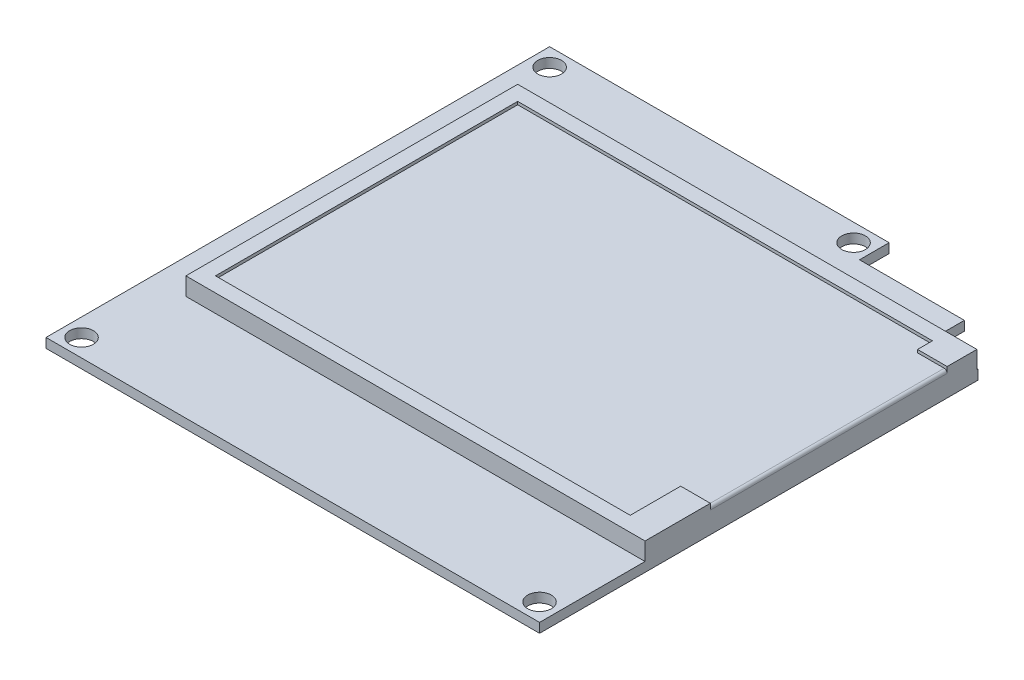
ISO-10303-21;
HEADER;
FILE_DESCRIPTION(('STEP AP214'),'2;1');
FILE_NAME('part.step','',(''),(''),'','','');
FILE_SCHEMA(('AUTOMOTIVE_DESIGN { 1 0 10303 214 1 1 1 1 }'));
ENDSEC;
DATA;
#1=APPLICATION_CONTEXT('core data for automotive mechanical design processes');
#2=APPLICATION_PROTOCOL_DEFINITION('international standard','automotive_design',2000,#1);
#3=PRODUCT_CONTEXT('',#1,'mechanical');
#4=PRODUCT('Part','Part','',(#3));
#5=PRODUCT_RELATED_PRODUCT_CATEGORY('part','',(#4));
#6=PRODUCT_DEFINITION_FORMATION('','',#4);
#7=PRODUCT_DEFINITION_CONTEXT('part definition',#1,'design');
#8=PRODUCT_DEFINITION('design','',#6,#7);
#9=PRODUCT_DEFINITION_SHAPE('','',#8);
#10=(LENGTH_UNIT() NAMED_UNIT(*) SI_UNIT(.MILLI.,.METRE.));
#11=(NAMED_UNIT(*) PLANE_ANGLE_UNIT() SI_UNIT($,.RADIAN.));
#12=(NAMED_UNIT(*) SI_UNIT($,.STERADIAN.) SOLID_ANGLE_UNIT());
#13=UNCERTAINTY_MEASURE_WITH_UNIT(LENGTH_MEASURE(1.E-05),#10,'distance_accuracy_value','');
#14=(GEOMETRIC_REPRESENTATION_CONTEXT(3) GLOBAL_UNCERTAINTY_ASSIGNED_CONTEXT((#13)) GLOBAL_UNIT_ASSIGNED_CONTEXT((#10,
#11,#12)) REPRESENTATION_CONTEXT('',''));
#15=CARTESIAN_POINT('',(0.,0.,0.));
#16=DIRECTION('',(0.,0.,1.));
#17=DIRECTION('',(1.,0.,0.));
#18=AXIS2_PLACEMENT_3D('',#15,#16,#17);
#19=CARTESIAN_POINT('',(78.2993097594836,4.1,-20.3066246880764));
#20=DIRECTION('',(1.,0.,0.));
#21=DIRECTION('',(0.,0.,-1.));
#22=AXIS2_PLACEMENT_3D('',#19,#20,#21);
#23=PLANE('',#22);
#24=DIRECTION('',(0.,0.,-1.));
#25=VECTOR('',#24,1.);
#26=CARTESIAN_POINT('',(78.2993097594836,4.6,-20.3066246880764));
#27=LINE('',#26,#25);
#28=CARTESIAN_POINT('',(78.2993097594836,4.6,-20.3066246880764));
#29=VERTEX_POINT('',#28);
#30=CARTESIAN_POINT('',(78.2993097594836,4.6,-28.823239899312));
#31=VERTEX_POINT('',#30);
#32=EDGE_CURVE('E193',#29,#31,#27,.T.);
#33=ORIENTED_EDGE('',*,*,#32,.T.);
#34=DIRECTION('',(0.,1.,0.));
#35=VECTOR('',#34,1.);
#36=CARTESIAN_POINT('',(78.2993097594836,4.1,-28.823239899312));
#37=LINE('',#36,#35);
#38=CARTESIAN_POINT('',(78.2993097594836,4.1,-28.823239899312));
#39=VERTEX_POINT('',#38);
#40=EDGE_CURVE('E178',#39,#31,#37,.T.);
#41=ORIENTED_EDGE('',*,*,#40,.F.);
#42=DIRECTION('',(0.,0.,-1.));
#43=VECTOR('',#42,1.);
#44=CARTESIAN_POINT('',(78.2993097594836,4.1,-20.3066246880764));
#45=LINE('',#44,#43);
#46=CARTESIAN_POINT('',(78.2993097594836,4.1,-20.3066246880764));
#47=VERTEX_POINT('',#46);
#48=EDGE_CURVE('E190',#47,#39,#45,.T.);
#49=ORIENTED_EDGE('',*,*,#48,.F.);
#50=DIRECTION('',(0.,1.,0.));
#51=VECTOR('',#50,1.);
#52=CARTESIAN_POINT('',(78.2993097594836,4.1,-20.3066246880764));
#53=LINE('',#52,#51);
#54=EDGE_CURVE('E226',#47,#29,#53,.T.);
#55=ORIENTED_EDGE('',*,*,#54,.T.);
#56=EDGE_LOOP('',(#33,#41,#49,#55));
#57=FACE_BOUND('',#56,.T.);
#58=ADVANCED_FACE('F35',(#57),#23,.F.);
#59=CARTESIAN_POINT('',(0.,1.6,0.));
#60=DIRECTION('',(0.,-1.,0.));
#61=DIRECTION('',(0.,0.,-1.));
#62=AXIS2_PLACEMENT_3D('',#59,#60,#61);
#63=PLANE('',#62);
#64=CARTESIAN_POINT('',(54.3,1.6,-82.));
#65=DIRECTION('',(0.,1.,0.));
#66=DIRECTION('',(0.,0.,1.));
#67=AXIS2_PLACEMENT_3D('',#64,#65,#66);
#68=CIRCLE('',#67,2.);
#69=CARTESIAN_POINT('',(54.3,1.6,-80.));
#70=VERTEX_POINT('',#69);
#71=EDGE_CURVE('E264',#70,#70,#68,.T.);
#72=ORIENTED_EDGE('',*,*,#71,.F.);
#73=EDGE_LOOP('',(#72));
#74=FACE_BOUND('',#73,.T.);
#75=CARTESIAN_POINT('',(80.2982862480702,1.6,-2.99695975512394));
#76=DIRECTION('',(0.,1.,0.));
#77=DIRECTION('',(0.,0.,1.));
#78=AXIS2_PLACEMENT_3D('',#75,#76,#77);
#79=CIRCLE('',#78,2.);
#80=CARTESIAN_POINT('',(80.2982862480702,1.6,-0.996959755123939));
#81=VERTEX_POINT('',#80);
#82=EDGE_CURVE('E260',#81,#81,#79,.T.);
#83=ORIENTED_EDGE('',*,*,#82,.F.);
#84=EDGE_LOOP('',(#83));
#85=FACE_BOUND('',#84,.T.);
#86=CARTESIAN_POINT('',(3.,1.6,-2.99695975512394));
#87=DIRECTION('',(0.,1.,0.));
#88=DIRECTION('',(0.,0.,1.));
#89=AXIS2_PLACEMENT_3D('',#86,#87,#88);
#90=CIRCLE('',#89,2.);
#91=CARTESIAN_POINT('',(3.,1.6,-0.996959755123934));
#92=VERTEX_POINT('',#91);
#93=EDGE_CURVE('E271',#92,#92,#90,.T.);
#94=ORIENTED_EDGE('',*,*,#93,.F.);
#95=EDGE_LOOP('',(#94));
#96=FACE_BOUND('',#95,.T.);
#97=CARTESIAN_POINT('',(3.,1.6,-82.));
#98=DIRECTION('',(0.,1.,0.));
#99=DIRECTION('',(0.,0.,1.));
#100=AXIS2_PLACEMENT_3D('',#97,#98,#99);
#101=CIRCLE('',#100,2.);
#102=CARTESIAN_POINT('',(3.,1.6,-80.));
#103=VERTEX_POINT('',#102);
#104=EDGE_CURVE('E265',#103,#103,#101,.T.);
#105=ORIENTED_EDGE('',*,*,#104,.F.);
#106=EDGE_LOOP('',(#105));
#107=FACE_BOUND('',#106,.T.);
#108=DIRECTION('',(1.,0.,0.));
#109=VECTOR('',#108,1.);
#110=CARTESIAN_POINT('',(5.80191209881731,1.6,-17.8042595827786));
#111=LINE('',#110,#109);
#112=CARTESIAN_POINT('',(5.80191209881731,1.6,-17.8042595827786));
#113=VERTEX_POINT('',#112);
#114=CARTESIAN_POINT('',(83.3,1.6,-17.8042595827786));
#115=VERTEX_POINT('',#114);
#116=EDGE_CURVE('E246',#113,#115,#111,.T.);
#117=ORIENTED_EDGE('',*,*,#116,.F.);
#118=DIRECTION('',(0.,0.,1.));
#119=VECTOR('',#118,1.);
#120=CARTESIAN_POINT('',(5.80191209881731,1.6,-73.8083734325398));
#121=LINE('',#120,#119);
#122=CARTESIAN_POINT('',(5.80191209881731,1.6,-73.8083734325398));
#123=VERTEX_POINT('',#122);
#124=EDGE_CURVE('E243',#123,#113,#121,.T.);
#125=ORIENTED_EDGE('',*,*,#124,.F.);
#126=DIRECTION('',(-1.,0.,0.));
#127=VECTOR('',#126,1.);
#128=CARTESIAN_POINT('',(5.80191209881731,1.6,-73.8083734325398));
#129=LINE('',#128,#127);
#130=CARTESIAN_POINT('',(83.3,1.6,-73.8083734325398));
#131=VERTEX_POINT('',#130);
#132=EDGE_CURVE('E222',#131,#123,#129,.T.);
#133=ORIENTED_EDGE('',*,*,#132,.F.);
#134=DIRECTION('',(0.,0.,-1.));
#135=VECTOR('',#134,1.);
#136=CARTESIAN_POINT('',(83.3,1.6,0.));
#137=LINE('',#136,#135);
#138=CARTESIAN_POINT('',(83.3,1.6,-74.));
#139=VERTEX_POINT('',#138);
#140=EDGE_CURVE('E291',#131,#139,#137,.T.);
#141=ORIENTED_EDGE('',*,*,#140,.T.);
#142=DIRECTION('',(-1.,0.,0.));
#143=VECTOR('',#142,1.);
#144=CARTESIAN_POINT('',(75.,1.6,-74.));
#145=LINE('',#144,#143);
#146=CARTESIAN_POINT('',(75.,1.6,-74.));
#147=VERTEX_POINT('',#146);
#148=EDGE_CURVE('E294',#139,#147,#145,.T.);
#149=ORIENTED_EDGE('',*,*,#148,.T.);
#150=DIRECTION('',(0.,0.,-1.));
#151=VECTOR('',#150,1.);
#152=CARTESIAN_POINT('',(75.,1.6,-80.));
#153=LINE('',#152,#151);
#154=CARTESIAN_POINT('',(75.,1.6,-80.));
#155=VERTEX_POINT('',#154);
#156=EDGE_CURVE('E296',#147,#155,#153,.T.);
#157=ORIENTED_EDGE('',*,*,#156,.T.);
#158=DIRECTION('',(-1.,0.,0.));
#159=VECTOR('',#158,1.);
#160=CARTESIAN_POINT('',(57.3,1.6,-80.));
#161=LINE('',#160,#159);
#162=CARTESIAN_POINT('',(57.3,1.6,-80.));
#163=VERTEX_POINT('',#162);
#164=EDGE_CURVE('E298',#155,#163,#161,.T.);
#165=ORIENTED_EDGE('',*,*,#164,.T.);
#166=DIRECTION('',(0.,0.,-1.));
#167=VECTOR('',#166,1.);
#168=CARTESIAN_POINT('',(57.3,1.6,-85.));
#169=LINE('',#168,#167);
#170=CARTESIAN_POINT('',(57.3,1.6,-85.));
#171=VERTEX_POINT('',#170);
#172=EDGE_CURVE('E300',#163,#171,#169,.T.);
#173=ORIENTED_EDGE('',*,*,#172,.T.);
#174=DIRECTION('',(-1.,0.,0.));
#175=VECTOR('',#174,1.);
#176=CARTESIAN_POINT('',(0.,1.6,-85.));
#177=LINE('',#176,#175);
#178=CARTESIAN_POINT('',(0.,1.6,-85.));
#179=VERTEX_POINT('',#178);
#180=EDGE_CURVE('E302',#171,#179,#177,.T.);
#181=ORIENTED_EDGE('',*,*,#180,.T.);
#182=DIRECTION('',(0.,0.,1.));
#183=VECTOR('',#182,1.);
#184=CARTESIAN_POINT('',(0.,1.6,0.));
#185=LINE('',#184,#183);
#186=CARTESIAN_POINT('',(0.,1.6,0.));
#187=VERTEX_POINT('',#186);
#188=EDGE_CURVE('E285',#179,#187,#185,.T.);
#189=ORIENTED_EDGE('',*,*,#188,.T.);
#190=DIRECTION('',(1.,0.,0.));
#191=VECTOR('',#190,1.);
#192=CARTESIAN_POINT('',(0.,1.6,0.));
#193=LINE('',#192,#191);
#194=CARTESIAN_POINT('',(83.3,1.6,0.));
#195=VERTEX_POINT('',#194);
#196=EDGE_CURVE('E288',#187,#195,#193,.T.);
#197=ORIENTED_EDGE('',*,*,#196,.T.);
#198=EDGE_CURVE('E292',#195,#115,#137,.T.);
#199=ORIENTED_EDGE('',*,*,#198,.T.);
#200=EDGE_LOOP('',(#117,#125,#133,#141,#149,#157,#165,#173,#181,#189,#197,#199));
#201=FACE_BOUND('',#200,.T.);
#202=ADVANCED_FACE('F369',(#74,#85,#96,#107,#201),#63,.F.);
#203=CARTESIAN_POINT('',(0.,1.6,0.));
#204=DIRECTION('',(1.,0.,0.));
#205=DIRECTION('',(0.,0.,-1.));
#206=AXIS2_PLACEMENT_3D('',#203,#204,#205);
#207=PLANE('',#206);
#208=DIRECTION('',(0.,0.,1.));
#209=VECTOR('',#208,1.);
#210=CARTESIAN_POINT('',(0.,0.,0.));
#211=LINE('',#210,#209);
#212=CARTESIAN_POINT('',(0.,0.,-85.));
#213=VERTEX_POINT('',#212);
#214=CARTESIAN_POINT('',(0.,0.,0.));
#215=VERTEX_POINT('',#214);
#216=EDGE_CURVE('E282',#213,#215,#211,.T.);
#217=ORIENTED_EDGE('',*,*,#216,.T.);
#218=DIRECTION('',(0.,-1.,0.));
#219=VECTOR('',#218,1.);
#220=CARTESIAN_POINT('',(0.,1.6,0.));
#221=LINE('',#220,#219);
#222=EDGE_CURVE('E340',#187,#215,#221,.T.);
#223=ORIENTED_EDGE('',*,*,#222,.F.);
#224=ORIENTED_EDGE('',*,*,#188,.F.);
#225=DIRECTION('',(0.,-1.,0.));
#226=VECTOR('',#225,1.);
#227=CARTESIAN_POINT('',(0.,1.6,-85.));
#228=LINE('',#227,#226);
#229=EDGE_CURVE('E304',#179,#213,#228,.T.);
#230=ORIENTED_EDGE('',*,*,#229,.T.);
#231=EDGE_LOOP('',(#217,#223,#224,#230));
#232=FACE_BOUND('',#231,.T.);
#233=ADVANCED_FACE('F428',(#232),#207,.F.);
#234=CARTESIAN_POINT('',(0.,1.6,0.));
#235=DIRECTION('',(0.,0.,-1.));
#236=DIRECTION('',(-1.,0.,0.));
#237=AXIS2_PLACEMENT_3D('',#234,#235,#236);
#238=PLANE('',#237);
#239=DIRECTION('',(1.,0.,0.));
#240=VECTOR('',#239,1.);
#241=CARTESIAN_POINT('',(0.,0.,0.));
#242=LINE('',#241,#240);
#243=CARTESIAN_POINT('',(83.3,0.,0.));
#244=VERTEX_POINT('',#243);
#245=EDGE_CURVE('E307',#215,#244,#242,.T.);
#246=ORIENTED_EDGE('',*,*,#245,.T.);
#247=DIRECTION('',(0.,-1.,0.));
#248=VECTOR('',#247,1.);
#249=CARTESIAN_POINT('',(83.3,1.6,0.));
#250=LINE('',#249,#248);
#251=EDGE_CURVE('E337',#195,#244,#250,.T.);
#252=ORIENTED_EDGE('',*,*,#251,.F.);
#253=ORIENTED_EDGE('',*,*,#196,.F.);
#254=ORIENTED_EDGE('',*,*,#222,.T.);
#255=EDGE_LOOP('',(#246,#252,#253,#254));
#256=FACE_BOUND('',#255,.T.);
#257=ADVANCED_FACE('F373',(#256),#238,.F.);
#258=CARTESIAN_POINT('',(83.3,1.6,0.));
#259=DIRECTION('',(-1.,0.,0.));
#260=DIRECTION('',(0.,0.,1.));
#261=AXIS2_PLACEMENT_3D('',#258,#259,#260);
#262=PLANE('',#261);
#263=DIRECTION('',(0.,1.,0.));
#264=VECTOR('',#263,1.);
#265=CARTESIAN_POINT('',(83.3,4.1,-68.7958120823691));
#266=LINE('',#265,#264);
#267=CARTESIAN_POINT('',(83.3,3.6,-68.7958120823691));
#268=VERTEX_POINT('',#267);
#269=CARTESIAN_POINT('',(83.3,4.6,-68.7958120823691));
#270=VERTEX_POINT('',#269);
#271=EDGE_CURVE('E50',#268,#270,#266,.T.);
#272=ORIENTED_EDGE('',*,*,#271,.F.);
#273=DIRECTION('',(0.,0.,-1.));
#274=VECTOR('',#273,1.);
#275=CARTESIAN_POINT('',(83.3,3.6,-28.823239899312));
#276=LINE('',#275,#274);
#277=CARTESIAN_POINT('',(83.3,3.6,-28.823239899312));
#278=VERTEX_POINT('',#277);
#279=EDGE_CURVE('E345',#268,#278,#276,.F.);
#280=ORIENTED_EDGE('',*,*,#279,.T.);
#281=DIRECTION('',(0.,1.,0.));
#282=VECTOR('',#281,1.);
#283=CARTESIAN_POINT('',(83.3,4.1,-28.823239899312));
#284=LINE('',#283,#282);
#285=CARTESIAN_POINT('',(83.3,4.6,-28.823239899312));
#286=VERTEX_POINT('',#285);
#287=EDGE_CURVE('E57',#278,#286,#284,.T.);
#288=ORIENTED_EDGE('',*,*,#287,.T.);
#289=DIRECTION('',(0.,0.,-1.));
#290=VECTOR('',#289,1.);
#291=CARTESIAN_POINT('',(83.3,4.6,-73.8083734325398));
#292=LINE('',#291,#290);
#293=CARTESIAN_POINT('',(83.3,4.6,-17.8042595827786));
#294=VERTEX_POINT('',#293);
#295=EDGE_CURVE('E230',#294,#286,#292,.T.);
#296=ORIENTED_EDGE('',*,*,#295,.F.);
#297=DIRECTION('',(0.,-1.,0.));
#298=VECTOR('',#297,1.);
#299=CARTESIAN_POINT('',(83.3,4.6,-17.8042595827786));
#300=LINE('',#299,#298);
#301=EDGE_CURVE('E240',#294,#115,#300,.T.);
#302=ORIENTED_EDGE('',*,*,#301,.T.);
#303=ORIENTED_EDGE('',*,*,#198,.F.);
#304=ORIENTED_EDGE('',*,*,#251,.T.);
#305=DIRECTION('',(0.,0.,-1.));
#306=VECTOR('',#305,1.);
#307=CARTESIAN_POINT('',(83.3,0.,0.));
#308=LINE('',#307,#306);
#309=CARTESIAN_POINT('',(83.3,0.,-74.));
#310=VERTEX_POINT('',#309);
#311=EDGE_CURVE('E309',#244,#310,#308,.T.);
#312=ORIENTED_EDGE('',*,*,#311,.T.);
#313=DIRECTION('',(0.,-1.,0.));
#314=VECTOR('',#313,1.);
#315=CARTESIAN_POINT('',(83.3,1.6,-74.));
#316=LINE('',#315,#314);
#317=EDGE_CURVE('E334',#139,#310,#316,.T.);
#318=ORIENTED_EDGE('',*,*,#317,.F.);
#319=ORIENTED_EDGE('',*,*,#140,.F.);
#320=DIRECTION('',(0.,-1.,0.));
#321=VECTOR('',#320,1.);
#322=CARTESIAN_POINT('',(83.3,4.6,-73.8083734325398));
#323=LINE('',#322,#321);
#324=CARTESIAN_POINT('',(83.3,4.6,-73.8083734325398));
#325=VERTEX_POINT('',#324);
#326=EDGE_CURVE('E257',#325,#131,#323,.T.);
#327=ORIENTED_EDGE('',*,*,#326,.F.);
#328=EDGE_CURVE('E234',#270,#325,#292,.T.);
#329=ORIENTED_EDGE('',*,*,#328,.F.);
#330=EDGE_LOOP('',(#272,#280,#288,#296,#302,#303,#304,#312,#318,#319,#327,#329));
#331=FACE_BOUND('',#330,.T.);
#332=ADVANCED_FACE('F353',(#331),#262,.F.);
#333=CARTESIAN_POINT('',(75.,1.6,-74.));
#334=DIRECTION('',(0.,0.,1.));
#335=DIRECTION('',(1.,0.,0.));
#336=AXIS2_PLACEMENT_3D('',#333,#334,#335);
#337=PLANE('',#336);
#338=DIRECTION('',(-1.,0.,0.));
#339=VECTOR('',#338,1.);
#340=CARTESIAN_POINT('',(75.,0.,-74.));
#341=LINE('',#340,#339);
#342=CARTESIAN_POINT('',(75.,0.,-74.));
#343=VERTEX_POINT('',#342);
#344=EDGE_CURVE('E311',#310,#343,#341,.T.);
#345=ORIENTED_EDGE('',*,*,#344,.T.);
#346=DIRECTION('',(0.,-1.,0.));
#347=VECTOR('',#346,1.);
#348=CARTESIAN_POINT('',(75.,1.6,-74.));
#349=LINE('',#348,#347);
#350=EDGE_CURVE('E331',#147,#343,#349,.T.);
#351=ORIENTED_EDGE('',*,*,#350,.F.);
#352=ORIENTED_EDGE('',*,*,#148,.F.);
#353=ORIENTED_EDGE('',*,*,#317,.T.);
#354=EDGE_LOOP('',(#345,#351,#352,#353));
#355=FACE_BOUND('',#354,.T.);
#356=ADVANCED_FACE('F384',(#355),#337,.F.);
#357=CARTESIAN_POINT('',(75.,1.6,-80.));
#358=DIRECTION('',(-1.,0.,0.));
#359=DIRECTION('',(0.,0.,1.));
#360=AXIS2_PLACEMENT_3D('',#357,#358,#359);
#361=PLANE('',#360);
#362=DIRECTION('',(0.,0.,-1.));
#363=VECTOR('',#362,1.);
#364=CARTESIAN_POINT('',(75.,0.,-80.));
#365=LINE('',#364,#363);
#366=CARTESIAN_POINT('',(75.,0.,-80.));
#367=VERTEX_POINT('',#366);
#368=EDGE_CURVE('E313',#343,#367,#365,.T.);
#369=ORIENTED_EDGE('',*,*,#368,.T.);
#370=DIRECTION('',(0.,-1.,0.));
#371=VECTOR('',#370,1.);
#372=CARTESIAN_POINT('',(75.,1.6,-80.));
#373=LINE('',#372,#371);
#374=EDGE_CURVE('E328',#155,#367,#373,.T.);
#375=ORIENTED_EDGE('',*,*,#374,.F.);
#376=ORIENTED_EDGE('',*,*,#156,.F.);
#377=ORIENTED_EDGE('',*,*,#350,.T.);
#378=EDGE_LOOP('',(#369,#375,#376,#377));
#379=FACE_BOUND('',#378,.T.);
#380=ADVANCED_FACE('F455',(#379),#361,.F.);
#381=CARTESIAN_POINT('',(57.3,1.6,-80.));
#382=DIRECTION('',(0.,0.,1.));
#383=DIRECTION('',(1.,0.,0.));
#384=AXIS2_PLACEMENT_3D('',#381,#382,#383);
#385=PLANE('',#384);
#386=DIRECTION('',(-1.,0.,0.));
#387=VECTOR('',#386,1.);
#388=CARTESIAN_POINT('',(57.3,0.,-80.));
#389=LINE('',#388,#387);
#390=CARTESIAN_POINT('',(57.3,0.,-80.));
#391=VERTEX_POINT('',#390);
#392=EDGE_CURVE('E315',#367,#391,#389,.T.);
#393=ORIENTED_EDGE('',*,*,#392,.T.);
#394=DIRECTION('',(0.,-1.,0.));
#395=VECTOR('',#394,1.);
#396=CARTESIAN_POINT('',(57.3,1.6,-80.));
#397=LINE('',#396,#395);
#398=EDGE_CURVE('E325',#163,#391,#397,.T.);
#399=ORIENTED_EDGE('',*,*,#398,.F.);
#400=ORIENTED_EDGE('',*,*,#164,.F.);
#401=ORIENTED_EDGE('',*,*,#374,.T.);
#402=EDGE_LOOP('',(#393,#399,#400,#401));
#403=FACE_BOUND('',#402,.T.);
#404=ADVANCED_FACE('F451',(#403),#385,.F.);
#405=CARTESIAN_POINT('',(57.3,1.6,-85.));
#406=DIRECTION('',(-1.,0.,0.));
#407=DIRECTION('',(0.,0.,1.));
#408=AXIS2_PLACEMENT_3D('',#405,#406,#407);
#409=PLANE('',#408);
#410=DIRECTION('',(0.,0.,-1.));
#411=VECTOR('',#410,1.);
#412=CARTESIAN_POINT('',(57.3,0.,-85.));
#413=LINE('',#412,#411);
#414=CARTESIAN_POINT('',(57.3,0.,-85.));
#415=VERTEX_POINT('',#414);
#416=EDGE_CURVE('E317',#391,#415,#413,.T.);
#417=ORIENTED_EDGE('',*,*,#416,.T.);
#418=DIRECTION('',(0.,-1.,0.));
#419=VECTOR('',#418,1.);
#420=CARTESIAN_POINT('',(57.3,1.6,-85.));
#421=LINE('',#420,#419);
#422=EDGE_CURVE('E322',#171,#415,#421,.T.);
#423=ORIENTED_EDGE('',*,*,#422,.F.);
#424=ORIENTED_EDGE('',*,*,#172,.F.);
#425=ORIENTED_EDGE('',*,*,#398,.T.);
#426=EDGE_LOOP('',(#417,#423,#424,#425));
#427=FACE_BOUND('',#426,.T.);
#428=ADVANCED_FACE('F447',(#427),#409,.F.);
#429=CARTESIAN_POINT('',(0.,1.6,-85.));
#430=DIRECTION('',(0.,0.,1.));
#431=DIRECTION('',(1.,0.,0.));
#432=AXIS2_PLACEMENT_3D('',#429,#430,#431);
#433=PLANE('',#432);
#434=DIRECTION('',(-1.,0.,0.));
#435=VECTOR('',#434,1.);
#436=CARTESIAN_POINT('',(0.,0.,-85.));
#437=LINE('',#436,#435);
#438=EDGE_CURVE('E289',#415,#213,#437,.T.);
#439=ORIENTED_EDGE('',*,*,#438,.T.);
#440=ORIENTED_EDGE('',*,*,#229,.F.);
#441=ORIENTED_EDGE('',*,*,#180,.F.);
#442=ORIENTED_EDGE('',*,*,#422,.T.);
#443=EDGE_LOOP('',(#439,#440,#441,#442));
#444=FACE_BOUND('',#443,.T.);
#445=ADVANCED_FACE('F443',(#444),#433,.F.);
#446=CARTESIAN_POINT('',(0.,0.,0.));
#447=DIRECTION('',(0.,-1.,0.));
#448=DIRECTION('',(0.,0.,-1.));
#449=AXIS2_PLACEMENT_3D('',#446,#447,#448);
#450=PLANE('',#449);
#451=CARTESIAN_POINT('',(3.,0.,-82.));
#452=DIRECTION('',(0.,1.,0.));
#453=DIRECTION('',(0.,0.,1.));
#454=AXIS2_PLACEMENT_3D('',#451,#452,#453);
#455=CIRCLE('',#454,2.);
#456=CARTESIAN_POINT('',(3.,0.,-80.));
#457=VERTEX_POINT('',#456);
#458=EDGE_CURVE('E261',#457,#457,#455,.T.);
#459=ORIENTED_EDGE('',*,*,#458,.T.);
#460=EDGE_LOOP('',(#459));
#461=FACE_BOUND('',#460,.T.);
#462=CARTESIAN_POINT('',(3.,0.,-2.99695975512394));
#463=DIRECTION('',(0.,1.,0.));
#464=DIRECTION('',(0.,0.,1.));
#465=AXIS2_PLACEMENT_3D('',#462,#463,#464);
#466=CIRCLE('',#465,2.);
#467=CARTESIAN_POINT('',(3.,0.,-0.996959755123934));
#468=VERTEX_POINT('',#467);
#469=EDGE_CURVE('E268',#468,#468,#466,.T.);
#470=ORIENTED_EDGE('',*,*,#469,.T.);
#471=EDGE_LOOP('',(#470));
#472=FACE_BOUND('',#471,.T.);
#473=CARTESIAN_POINT('',(80.2982862480702,0.,-2.99695975512394));
#474=DIRECTION('',(0.,1.,0.));
#475=DIRECTION('',(0.,0.,1.));
#476=AXIS2_PLACEMENT_3D('',#473,#474,#475);
#477=CIRCLE('',#476,2.);
#478=CARTESIAN_POINT('',(80.2982862480702,0.,-0.996959755123939));
#479=VERTEX_POINT('',#478);
#480=EDGE_CURVE('E274',#479,#479,#477,.T.);
#481=ORIENTED_EDGE('',*,*,#480,.T.);
#482=EDGE_LOOP('',(#481));
#483=FACE_BOUND('',#482,.T.);
#484=CARTESIAN_POINT('',(54.3,0.,-82.));
#485=DIRECTION('',(0.,1.,0.));
#486=DIRECTION('',(0.,0.,1.));
#487=AXIS2_PLACEMENT_3D('',#484,#485,#486);
#488=CIRCLE('',#487,2.);
#489=CARTESIAN_POINT('',(54.3,0.,-80.));
#490=VERTEX_POINT('',#489);
#491=EDGE_CURVE('E279',#490,#490,#488,.T.);
#492=ORIENTED_EDGE('',*,*,#491,.T.);
#493=EDGE_LOOP('',(#492));
#494=FACE_BOUND('',#493,.T.);
#495=ORIENTED_EDGE('',*,*,#216,.F.);
#496=ORIENTED_EDGE('',*,*,#438,.F.);
#497=ORIENTED_EDGE('',*,*,#416,.F.);
#498=ORIENTED_EDGE('',*,*,#392,.F.);
#499=ORIENTED_EDGE('',*,*,#368,.F.);
#500=ORIENTED_EDGE('',*,*,#344,.F.);
#501=ORIENTED_EDGE('',*,*,#311,.F.);
#502=ORIENTED_EDGE('',*,*,#245,.F.);
#503=EDGE_LOOP('',(#495,#496,#497,#498,#499,#500,#501,#502));
#504=FACE_BOUND('',#503,.T.);
#505=ADVANCED_FACE('F376',(#461,#472,#483,#494,#504),#450,.T.);
#506=CARTESIAN_POINT('',(54.3,0.,-82.));
#507=DIRECTION('',(0.,1.,0.));
#508=DIRECTION('',(0.,0.,1.));
#509=AXIS2_PLACEMENT_3D('',#506,#507,#508);
#510=CYLINDRICAL_SURFACE('',#509,2.);
#511=ORIENTED_EDGE('',*,*,#491,.F.);
#512=EDGE_LOOP('',(#511));
#513=FACE_BOUND('',#512,.T.);
#514=ORIENTED_EDGE('',*,*,#71,.T.);
#515=EDGE_LOOP('',(#514));
#516=FACE_BOUND('',#515,.T.);
#517=ADVANCED_FACE('F439',(#513,#516),#510,.F.);
#518=CARTESIAN_POINT('',(80.2982862480702,0.,-2.99695975512394));
#519=DIRECTION('',(0.,1.,0.));
#520=DIRECTION('',(0.,0.,1.));
#521=AXIS2_PLACEMENT_3D('',#518,#519,#520);
#522=CYLINDRICAL_SURFACE('',#521,2.);
#523=ORIENTED_EDGE('',*,*,#480,.F.);
#524=EDGE_LOOP('',(#523));
#525=FACE_BOUND('',#524,.T.);
#526=ORIENTED_EDGE('',*,*,#82,.T.);
#527=EDGE_LOOP('',(#526));
#528=FACE_BOUND('',#527,.T.);
#529=ADVANCED_FACE('F504',(#525,#528),#522,.F.);
#530=CARTESIAN_POINT('',(3.,0.,-2.99695975512394));
#531=DIRECTION('',(0.,1.,0.));
#532=DIRECTION('',(0.,0.,1.));
#533=AXIS2_PLACEMENT_3D('',#530,#531,#532);
#534=CYLINDRICAL_SURFACE('',#533,2.);
#535=ORIENTED_EDGE('',*,*,#469,.F.);
#536=EDGE_LOOP('',(#535));
#537=FACE_BOUND('',#536,.T.);
#538=ORIENTED_EDGE('',*,*,#93,.T.);
#539=EDGE_LOOP('',(#538));
#540=FACE_BOUND('',#539,.T.);
#541=ADVANCED_FACE('F511',(#537,#540),#534,.F.);
#542=CARTESIAN_POINT('',(3.,0.,-82.));
#543=DIRECTION('',(0.,1.,0.));
#544=DIRECTION('',(0.,0.,1.));
#545=AXIS2_PLACEMENT_3D('',#542,#543,#544);
#546=CYLINDRICAL_SURFACE('',#545,2.);
#547=ORIENTED_EDGE('',*,*,#458,.F.);
#548=EDGE_LOOP('',(#547));
#549=FACE_BOUND('',#548,.T.);
#550=ORIENTED_EDGE('',*,*,#104,.T.);
#551=EDGE_LOOP('',(#550));
#552=FACE_BOUND('',#551,.T.);
#553=ADVANCED_FACE('F518',(#549,#552),#546,.F.);
#554=CARTESIAN_POINT('',(5.80191209881731,4.6,-73.8083734325398));
#555=DIRECTION('',(0.,0.,1.));
#556=DIRECTION('',(1.,0.,0.));
#557=AXIS2_PLACEMENT_3D('',#554,#555,#556);
#558=PLANE('',#557);
#559=ORIENTED_EDGE('',*,*,#132,.T.);
#560=DIRECTION('',(0.,-1.,0.));
#561=VECTOR('',#560,1.);
#562=CARTESIAN_POINT('',(5.80191209881731,4.6,-73.8083734325398));
#563=LINE('',#562,#561);
#564=CARTESIAN_POINT('',(5.80191209881731,4.6,-73.8083734325398));
#565=VERTEX_POINT('',#564);
#566=EDGE_CURVE('E254',#565,#123,#563,.T.);
#567=ORIENTED_EDGE('',*,*,#566,.F.);
#568=DIRECTION('',(-1.,0.,0.));
#569=VECTOR('',#568,1.);
#570=CARTESIAN_POINT('',(5.80191209881731,4.6,-73.8083734325398));
#571=LINE('',#570,#569);
#572=EDGE_CURVE('E233',#325,#565,#571,.T.);
#573=ORIENTED_EDGE('',*,*,#572,.F.);
#574=ORIENTED_EDGE('',*,*,#326,.T.);
#575=EDGE_LOOP('',(#559,#567,#573,#574));
#576=FACE_BOUND('',#575,.T.);
#577=ADVANCED_FACE('F391',(#576),#558,.F.);
#578=CARTESIAN_POINT('',(5.80191209881731,4.6,-73.8083734325398));
#579=DIRECTION('',(1.,0.,0.));
#580=DIRECTION('',(0.,0.,-1.));
#581=AXIS2_PLACEMENT_3D('',#578,#579,#580);
#582=PLANE('',#581);
#583=ORIENTED_EDGE('',*,*,#124,.T.);
#584=DIRECTION('',(0.,-1.,0.));
#585=VECTOR('',#584,1.);
#586=CARTESIAN_POINT('',(5.80191209881731,4.6,-17.8042595827786));
#587=LINE('',#586,#585);
#588=CARTESIAN_POINT('',(5.80191209881731,4.6,-17.8042595827786));
#589=VERTEX_POINT('',#588);
#590=EDGE_CURVE('E251',#589,#113,#587,.T.);
#591=ORIENTED_EDGE('',*,*,#590,.F.);
#592=DIRECTION('',(0.,0.,1.));
#593=VECTOR('',#592,1.);
#594=CARTESIAN_POINT('',(5.80191209881731,4.6,-73.8083734325398));
#595=LINE('',#594,#593);
#596=EDGE_CURVE('E236',#565,#589,#595,.T.);
#597=ORIENTED_EDGE('',*,*,#596,.F.);
#598=ORIENTED_EDGE('',*,*,#566,.T.);
#599=EDGE_LOOP('',(#583,#591,#597,#598));
#600=FACE_BOUND('',#599,.T.);
#601=ADVANCED_FACE('F534',(#600),#582,.F.);
#602=CARTESIAN_POINT('',(5.80191209881731,4.6,-17.8042595827786));
#603=DIRECTION('',(0.,0.,-1.));
#604=DIRECTION('',(-1.,0.,0.));
#605=AXIS2_PLACEMENT_3D('',#602,#603,#604);
#606=PLANE('',#605);
#607=ORIENTED_EDGE('',*,*,#116,.T.);
#608=ORIENTED_EDGE('',*,*,#301,.F.);
#609=DIRECTION('',(1.,0.,0.));
#610=VECTOR('',#609,1.);
#611=CARTESIAN_POINT('',(5.80191209881731,4.6,-17.8042595827786));
#612=LINE('',#611,#610);
#613=EDGE_CURVE('E238',#589,#294,#612,.T.);
#614=ORIENTED_EDGE('',*,*,#613,.F.);
#615=ORIENTED_EDGE('',*,*,#590,.T.);
#616=EDGE_LOOP('',(#607,#608,#614,#615));
#617=FACE_BOUND('',#616,.T.);
#618=ADVANCED_FACE('F364',(#617),#606,.F.);
#619=CARTESIAN_POINT('',(0.,4.6,0.));
#620=DIRECTION('',(0.,1.,0.));
#621=DIRECTION('',(0.,0.,1.));
#622=AXIS2_PLACEMENT_3D('',#619,#620,#621);
#623=PLANE('',#622);
#624=DIRECTION('',(1.,0.,0.));
#625=VECTOR('',#624,1.);
#626=CARTESIAN_POINT('',(83.3,4.6,-28.823239899312));
#627=LINE('',#626,#625);
#628=EDGE_CURVE('E358',#31,#286,#627,.T.);
#629=ORIENTED_EDGE('',*,*,#628,.F.);
#630=ORIENTED_EDGE('',*,*,#32,.F.);
#631=DIRECTION('',(1.,0.,0.));
#632=VECTOR('',#631,1.);
#633=CARTESIAN_POINT('',(78.2993097594836,4.6,-20.3066246880764));
#634=LINE('',#633,#632);
#635=CARTESIAN_POINT('',(8.29846817880286,4.6,-20.3066246880764));
#636=VERTEX_POINT('',#635);
#637=EDGE_CURVE('E211',#636,#29,#634,.T.);
#638=ORIENTED_EDGE('',*,*,#637,.F.);
#639=DIRECTION('',(0.,0.,1.));
#640=VECTOR('',#639,1.);
#641=CARTESIAN_POINT('',(8.29846817880286,4.6,-20.3066246880764));
#642=LINE('',#641,#640);
#643=CARTESIAN_POINT('',(8.29846817880286,4.6,-71.3111066244574));
#644=VERTEX_POINT('',#643);
#645=EDGE_CURVE('E209',#644,#636,#642,.T.);
#646=ORIENTED_EDGE('',*,*,#645,.F.);
#647=DIRECTION('',(-1.,0.,0.));
#648=VECTOR('',#647,1.);
#649=CARTESIAN_POINT('',(78.2993097594836,4.6,-71.3111066244574));
#650=LINE('',#649,#648);
#651=CARTESIAN_POINT('',(78.2993097594836,4.6,-71.3111066244574));
#652=VERTEX_POINT('',#651);
#653=EDGE_CURVE('E216',#652,#644,#650,.T.);
#654=ORIENTED_EDGE('',*,*,#653,.F.);
#655=CARTESIAN_POINT('',(78.2993097594836,4.6,-68.7958120823691));
#656=VERTEX_POINT('',#655);
#657=EDGE_CURVE('E214',#656,#652,#27,.T.);
#658=ORIENTED_EDGE('',*,*,#657,.F.);
#659=DIRECTION('',(-1.,0.,0.));
#660=VECTOR('',#659,1.);
#661=CARTESIAN_POINT('',(83.3,4.6,-68.7958120823691));
#662=LINE('',#661,#660);
#663=EDGE_CURVE('E394',#270,#656,#662,.T.);
#664=ORIENTED_EDGE('',*,*,#663,.F.);
#665=ORIENTED_EDGE('',*,*,#328,.T.);
#666=ORIENTED_EDGE('',*,*,#572,.T.);
#667=ORIENTED_EDGE('',*,*,#596,.T.);
#668=ORIENTED_EDGE('',*,*,#613,.T.);
#669=ORIENTED_EDGE('',*,*,#295,.T.);
#670=EDGE_LOOP('',(#629,#630,#638,#646,#654,#658,#664,#665,#666,#667,#668,#669));
#671=FACE_BOUND('',#670,.T.);
#672=ADVANCED_FACE('F357',(#671),#623,.T.);
#673=CARTESIAN_POINT('',(8.29846817880286,4.1,-20.3066246880764));
#674=DIRECTION('',(-1.,0.,0.));
#675=DIRECTION('',(0.,0.,1.));
#676=AXIS2_PLACEMENT_3D('',#673,#674,#675);
#677=PLANE('',#676);
#678=ORIENTED_EDGE('',*,*,#645,.T.);
#679=DIRECTION('',(0.,1.,0.));
#680=VECTOR('',#679,1.);
#681=CARTESIAN_POINT('',(8.29846817880286,4.1,-20.3066246880764));
#682=LINE('',#681,#680);
#683=CARTESIAN_POINT('',(8.29846817880286,4.1,-20.3066246880764));
#684=VERTEX_POINT('',#683);
#685=EDGE_CURVE('E204',#684,#636,#682,.T.);
#686=ORIENTED_EDGE('',*,*,#685,.F.);
#687=DIRECTION('',(0.,0.,1.));
#688=VECTOR('',#687,1.);
#689=CARTESIAN_POINT('',(8.29846817880286,4.1,-20.3066246880764));
#690=LINE('',#689,#688);
#691=CARTESIAN_POINT('',(8.29846817880286,4.1,-71.3111066244574));
#692=VERTEX_POINT('',#691);
#693=EDGE_CURVE('E219',#692,#684,#690,.T.);
#694=ORIENTED_EDGE('',*,*,#693,.F.);
#695=DIRECTION('',(0.,1.,0.));
#696=VECTOR('',#695,1.);
#697=CARTESIAN_POINT('',(8.29846817880286,4.1,-71.3111066244574));
#698=LINE('',#697,#696);
#699=EDGE_CURVE('E220',#692,#644,#698,.T.);
#700=ORIENTED_EDGE('',*,*,#699,.T.);
#701=EDGE_LOOP('',(#678,#686,#694,#700));
#702=FACE_BOUND('',#701,.T.);
#703=ADVANCED_FACE('F405',(#702),#677,.F.);
#704=CARTESIAN_POINT('',(78.2993097594836,4.1,-71.3111066244574));
#705=DIRECTION('',(0.,0.,-1.));
#706=DIRECTION('',(-1.,0.,0.));
#707=AXIS2_PLACEMENT_3D('',#704,#705,#706);
#708=PLANE('',#707);
#709=ORIENTED_EDGE('',*,*,#653,.T.);
#710=ORIENTED_EDGE('',*,*,#699,.F.);
#711=DIRECTION('',(-1.,0.,0.));
#712=VECTOR('',#711,1.);
#713=CARTESIAN_POINT('',(78.2993097594836,4.1,-71.3111066244574));
#714=LINE('',#713,#712);
#715=CARTESIAN_POINT('',(78.2993097594836,4.1,-71.3111066244574));
#716=VERTEX_POINT('',#715);
#717=EDGE_CURVE('E200',#716,#692,#714,.T.);
#718=ORIENTED_EDGE('',*,*,#717,.F.);
#719=DIRECTION('',(0.,1.,0.));
#720=VECTOR('',#719,1.);
#721=CARTESIAN_POINT('',(78.2993097594836,4.1,-71.3111066244574));
#722=LINE('',#721,#720);
#723=EDGE_CURVE('E223',#716,#652,#722,.T.);
#724=ORIENTED_EDGE('',*,*,#723,.T.);
#725=EDGE_LOOP('',(#709,#710,#718,#724));
#726=FACE_BOUND('',#725,.T.);
#727=ADVANCED_FACE('F411',(#726),#708,.F.);
#728=CARTESIAN_POINT('',(78.2993097594836,4.1,-68.7958120823691));
#729=VERTEX_POINT('',#728);
#730=EDGE_CURVE('E201',#729,#716,#45,.T.);
#731=ORIENTED_EDGE('',*,*,#730,.F.);
#732=DIRECTION('',(0.,1.,0.));
#733=VECTOR('',#732,1.);
#734=CARTESIAN_POINT('',(78.2993097594836,4.1,-68.7958120823691));
#735=LINE('',#734,#733);
#736=EDGE_CURVE('E194',#729,#656,#735,.T.);
#737=ORIENTED_EDGE('',*,*,#736,.T.);
#738=ORIENTED_EDGE('',*,*,#657,.T.);
#739=ORIENTED_EDGE('',*,*,#723,.F.);
#740=EDGE_LOOP('',(#731,#737,#738,#739));
#741=FACE_BOUND('',#740,.T.);
#742=ADVANCED_FACE('F415',(#741),#23,.F.);
#743=CARTESIAN_POINT('',(78.2993097594836,4.1,-20.3066246880764));
#744=DIRECTION('',(0.,0.,1.));
#745=DIRECTION('',(1.,0.,0.));
#746=AXIS2_PLACEMENT_3D('',#743,#744,#745);
#747=PLANE('',#746);
#748=ORIENTED_EDGE('',*,*,#637,.T.);
#749=ORIENTED_EDGE('',*,*,#54,.F.);
#750=DIRECTION('',(1.,0.,0.));
#751=VECTOR('',#750,1.);
#752=CARTESIAN_POINT('',(78.2993097594836,4.1,-20.3066246880764));
#753=LINE('',#752,#751);
#754=EDGE_CURVE('E199',#684,#47,#753,.T.);
#755=ORIENTED_EDGE('',*,*,#754,.F.);
#756=ORIENTED_EDGE('',*,*,#685,.T.);
#757=EDGE_LOOP('',(#748,#749,#755,#756));
#758=FACE_BOUND('',#757,.T.);
#759=ADVANCED_FACE('F409',(#758),#747,.F.);
#760=CARTESIAN_POINT('',(0.,4.1,0.));
#761=DIRECTION('',(0.,1.,0.));
#762=DIRECTION('',(0.,0.,1.));
#763=AXIS2_PLACEMENT_3D('',#760,#761,#762);
#764=PLANE('',#763);
#765=DIRECTION('',(1.,0.,0.));
#766=VECTOR('',#765,1.);
#767=CARTESIAN_POINT('',(83.3,4.1,-28.823239899312));
#768=LINE('',#767,#766);
#769=CARTESIAN_POINT('',(82.8,4.1,-28.823239899312));
#770=VERTEX_POINT('',#769);
#771=EDGE_CURVE('E175',#39,#770,#768,.T.);
#772=ORIENTED_EDGE('',*,*,#771,.T.);
#773=DIRECTION('',(0.,0.,-1.));
#774=VECTOR('',#773,1.);
#775=CARTESIAN_POINT('',(82.8,4.1,-68.7958120823691));
#776=LINE('',#775,#774);
#777=CARTESIAN_POINT('',(82.8,4.1,-68.7958120823691));
#778=VERTEX_POINT('',#777);
#779=EDGE_CURVE('E343',#770,#778,#776,.T.);
#780=ORIENTED_EDGE('',*,*,#779,.T.);
#781=DIRECTION('',(-1.,0.,0.));
#782=VECTOR('',#781,1.);
#783=CARTESIAN_POINT('',(83.3,4.1,-68.7958120823691));
#784=LINE('',#783,#782);
#785=EDGE_CURVE('E185',#778,#729,#784,.T.);
#786=ORIENTED_EDGE('',*,*,#785,.T.);
#787=ORIENTED_EDGE('',*,*,#730,.T.);
#788=ORIENTED_EDGE('',*,*,#717,.T.);
#789=ORIENTED_EDGE('',*,*,#693,.T.);
#790=ORIENTED_EDGE('',*,*,#754,.T.);
#791=ORIENTED_EDGE('',*,*,#48,.T.);
#792=EDGE_LOOP('',(#772,#780,#786,#787,#788,#789,#790,#791));
#793=FACE_BOUND('',#792,.T.);
#794=ADVANCED_FACE('F196',(#793),#764,.T.);
#795=CARTESIAN_POINT('',(83.3,4.1,-28.823239899312));
#796=DIRECTION('',(0.,0.,1.));
#797=DIRECTION('',(1.,0.,0.));
#798=AXIS2_PLACEMENT_3D('',#795,#796,#797);
#799=PLANE('',#798);
#800=ORIENTED_EDGE('',*,*,#628,.T.);
#801=ORIENTED_EDGE('',*,*,#287,.F.);
#802=CARTESIAN_POINT('',(82.8,3.6,-28.823239899312));
#803=DIRECTION('',(0.,0.,1.));
#804=DIRECTION('',(1.,0.,0.));
#805=AXIS2_PLACEMENT_3D('',#802,#803,#804);
#806=CIRCLE('',#805,0.5);
#807=EDGE_CURVE('E11',#278,#770,#806,.T.);
#808=ORIENTED_EDGE('',*,*,#807,.T.);
#809=ORIENTED_EDGE('',*,*,#771,.F.);
#810=ORIENTED_EDGE('',*,*,#40,.T.);
#811=EDGE_LOOP('',(#800,#801,#808,#809,#810));
#812=FACE_BOUND('',#811,.T.);
#813=ADVANCED_FACE('F177',(#812),#799,.F.);
#814=CARTESIAN_POINT('',(83.3,4.1,-68.7958120823691));
#815=DIRECTION('',(0.,0.,-1.));
#816=DIRECTION('',(-1.,0.,0.));
#817=AXIS2_PLACEMENT_3D('',#814,#815,#816);
#818=PLANE('',#817);
#819=ORIENTED_EDGE('',*,*,#663,.T.);
#820=ORIENTED_EDGE('',*,*,#736,.F.);
#821=ORIENTED_EDGE('',*,*,#785,.F.);
#822=CARTESIAN_POINT('',(82.8,3.6,-68.7958120823691));
#823=DIRECTION('',(0.,0.,-1.));
#824=DIRECTION('',(-1.,0.,0.));
#825=AXIS2_PLACEMENT_3D('',#822,#823,#824);
#826=CIRCLE('',#825,0.5);
#827=EDGE_CURVE('E43',#778,#268,#826,.T.);
#828=ORIENTED_EDGE('',*,*,#827,.T.);
#829=ORIENTED_EDGE('',*,*,#271,.T.);
#830=EDGE_LOOP('',(#819,#820,#821,#828,#829));
#831=FACE_BOUND('',#830,.T.);
#832=ADVANCED_FACE('F349',(#831),#818,.F.);
#833=CARTESIAN_POINT('',(82.8,3.6,0.));
#834=DIRECTION('',(0.,0.,1.));
#835=DIRECTION('',(1.,0.,0.));
#836=AXIS2_PLACEMENT_3D('',#833,#834,#835);
#837=CYLINDRICAL_SURFACE('',#836,0.5);
#838=ORIENTED_EDGE('',*,*,#807,.F.);
#839=ORIENTED_EDGE('',*,*,#279,.F.);
#840=ORIENTED_EDGE('',*,*,#827,.F.);
#841=ORIENTED_EDGE('',*,*,#779,.F.);
#842=EDGE_LOOP('',(#838,#839,#840,#841));
#843=FACE_BOUND('',#842,.T.);
#844=ADVANCED_FACE('F37',(#843),#837,.T.);
#845=CLOSED_SHELL('',(#58,#202,#233,#257,#332,#356,#380,#404,#428,#445,#505,#517,#529,#541,#553,
#577,#601,#618,#672,#703,#727,#742,#759,#794,#813,#832,#844));
#846=MANIFOLD_SOLID_BREP('B2',#845);
#847=ADVANCED_BREP_SHAPE_REPRESENTATION('',(#18,#846),#14);
#848=SHAPE_DEFINITION_REPRESENTATION(#9,#847);
ENDSEC;
END-ISO-10303-21;
